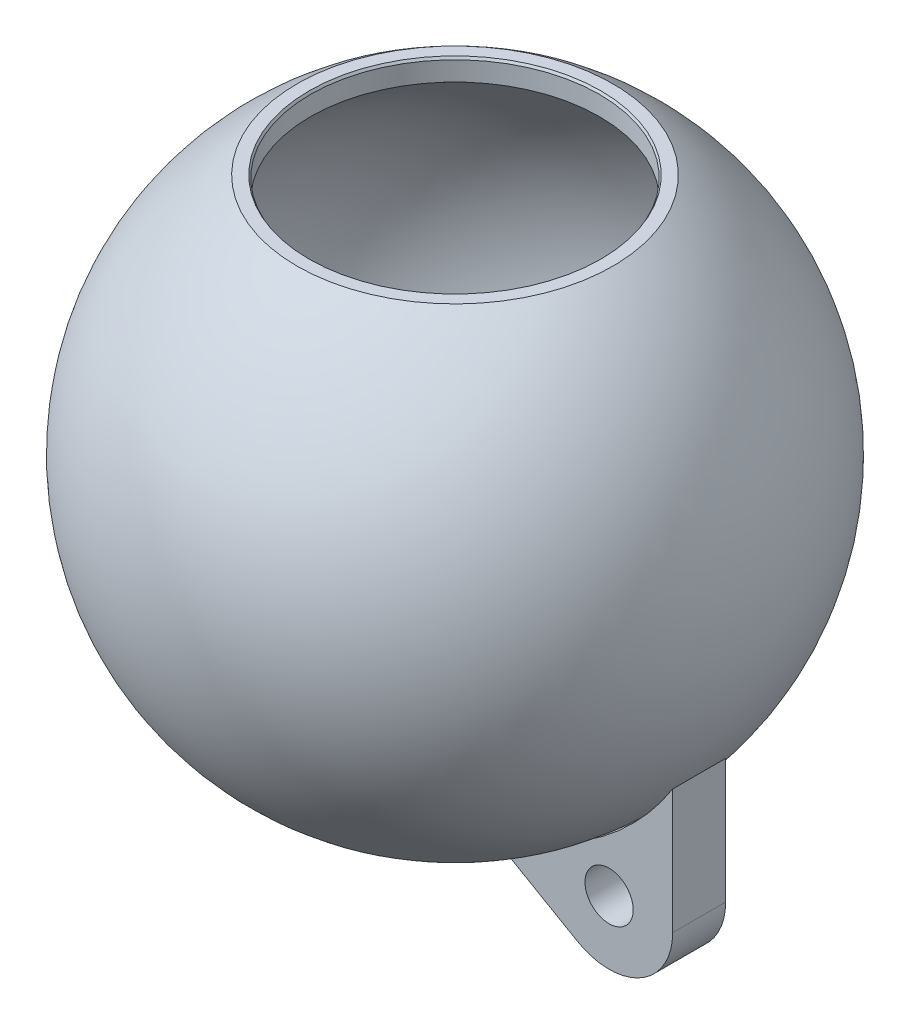
ISO-10303-21;
HEADER;
FILE_DESCRIPTION(('STEP AP214'),'2;1');
FILE_NAME('part.step','',(''),(''),'','','');
FILE_SCHEMA(('AUTOMOTIVE_DESIGN { 1 0 10303 214 1 1 1 1 }'));
ENDSEC;
DATA;
#1=APPLICATION_CONTEXT('core data for automotive mechanical design processes');
#2=APPLICATION_PROTOCOL_DEFINITION('international standard','automotive_design',2000,#1);
#3=PRODUCT_CONTEXT('',#1,'mechanical');
#4=PRODUCT('Part','Part','',(#3));
#5=PRODUCT_RELATED_PRODUCT_CATEGORY('part','',(#4));
#6=PRODUCT_DEFINITION_FORMATION('','',#4);
#7=PRODUCT_DEFINITION_CONTEXT('part definition',#1,'design');
#8=PRODUCT_DEFINITION('design','',#6,#7);
#9=PRODUCT_DEFINITION_SHAPE('','',#8);
#10=(LENGTH_UNIT() NAMED_UNIT(*) SI_UNIT(.MILLI.,.METRE.));
#11=(NAMED_UNIT(*) PLANE_ANGLE_UNIT() SI_UNIT($,.RADIAN.));
#12=(NAMED_UNIT(*) SI_UNIT($,.STERADIAN.) SOLID_ANGLE_UNIT());
#13=UNCERTAINTY_MEASURE_WITH_UNIT(LENGTH_MEASURE(1.E-05),#10,'distance_accuracy_value','');
#14=(GEOMETRIC_REPRESENTATION_CONTEXT(3) GLOBAL_UNCERTAINTY_ASSIGNED_CONTEXT((#13)) GLOBAL_UNIT_ASSIGNED_CONTEXT((#10,
#11,#12)) REPRESENTATION_CONTEXT('',''));
#15=CARTESIAN_POINT('',(0.,0.,0.));
#16=DIRECTION('',(0.,0.,1.));
#17=DIRECTION('',(1.,0.,0.));
#18=AXIS2_PLACEMENT_3D('',#15,#16,#17);
#19=CARTESIAN_POINT('',(95.2500000000001,-147.117317471466,-13.97));
#20=DIRECTION('',(0.,0.,1.));
#21=DIRECTION('',(1.,0.,0.));
#22=AXIS2_PLACEMENT_3D('',#19,#20,#21);
#23=CYLINDRICAL_SURFACE('',#22,33.528);
#24=DIRECTION('',(0.,0.,1.));
#25=VECTOR('',#24,1.);
#26=CARTESIAN_POINT('',(128.778,-147.117317471466,-13.97));
#27=LINE('',#26,#25);
#28=CARTESIAN_POINT('',(128.778,-147.117317471466,-13.97));
#29=VERTEX_POINT('',#28);
#30=CARTESIAN_POINT('',(128.778,-147.117317471466,13.97));
#31=VERTEX_POINT('',#30);
#32=EDGE_CURVE('E62',#29,#31,#27,.T.);
#33=ORIENTED_EDGE('',*,*,#32,.T.);
#34=CARTESIAN_POINT('',(95.2500000000001,-147.117317471466,13.97));
#35=DIRECTION('',(0.,0.,1.));
#36=DIRECTION('',(-1.,0.,0.));
#37=AXIS2_PLACEMENT_3D('',#34,#35,#36);
#38=CIRCLE('',#37,33.528);
#39=CARTESIAN_POINT('',(78.4859999999999,-176.15341720955,13.97));
#40=VERTEX_POINT('',#39);
#41=EDGE_CURVE('E103',#40,#31,#38,.T.);
#42=ORIENTED_EDGE('',*,*,#41,.F.);
#43=DIRECTION('',(0.,0.,1.));
#44=VECTOR('',#43,1.);
#45=CARTESIAN_POINT('',(78.4859999999999,-176.15341720955,-13.97));
#46=LINE('',#45,#44);
#47=CARTESIAN_POINT('',(78.4859999999999,-176.15341720955,-13.97));
#48=VERTEX_POINT('',#47);
#49=EDGE_CURVE('E13',#48,#40,#46,.T.);
#50=ORIENTED_EDGE('',*,*,#49,.F.);
#51=CARTESIAN_POINT('',(95.2500000000001,-147.117317471466,-13.97));
#52=DIRECTION('',(0.,0.,1.));
#53=DIRECTION('',(-1.,0.,0.));
#54=AXIS2_PLACEMENT_3D('',#51,#52,#53);
#55=CIRCLE('',#54,33.528);
#56=EDGE_CURVE('E104',#48,#29,#55,.T.);
#57=ORIENTED_EDGE('',*,*,#56,.T.);
#58=EDGE_LOOP('',(#33,#42,#50,#57));
#59=FACE_BOUND('',#58,.T.);
#60=ADVANCED_FACE('F59',(#59),#23,.T.);
#61=CARTESIAN_POINT('',(78.4859999999999,-176.15341720955,-13.97));
#62=DIRECTION('',(-0.500000000000004,-0.866025403784436,0.));
#63=DIRECTION('',(0.866025403784436,-0.500000000000004,0.));
#64=AXIS2_PLACEMENT_3D('',#61,#62,#63);
#65=PLANE('',#64);
#66=ORIENTED_EDGE('',*,*,#49,.T.);
#67=DIRECTION('',(0.866025403784436,-0.500000000000004,0.));
#68=VECTOR('',#67,1.);
#69=CARTESIAN_POINT('',(78.4859999999999,-176.15341720955,13.97));
#70=LINE('',#69,#68);
#71=CARTESIAN_POINT('',(31.6052209873836,-149.086786826796,13.97));
#72=VERTEX_POINT('',#71);
#73=EDGE_CURVE('E123',#72,#40,#70,.T.);
#74=ORIENTED_EDGE('',*,*,#73,.F.);
#75=DIRECTION('',(0.,0.,1.));
#76=VECTOR('',#75,1.);
#77=CARTESIAN_POINT('',(31.6052209873836,-149.086786826796,-13.97));
#78=LINE('',#77,#76);
#79=CARTESIAN_POINT('',(31.6052209873836,-149.086786826796,-13.97));
#80=VERTEX_POINT('',#79);
#81=EDGE_CURVE('E67',#80,#72,#78,.T.);
#82=ORIENTED_EDGE('',*,*,#81,.F.);
#83=DIRECTION('',(0.866025403784436,-0.500000000000004,0.));
#84=VECTOR('',#83,1.);
#85=CARTESIAN_POINT('',(78.4859999999999,-176.15341720955,-13.97));
#86=LINE('',#85,#84);
#87=EDGE_CURVE('E110',#80,#48,#86,.T.);
#88=ORIENTED_EDGE('',*,*,#87,.T.);
#89=EDGE_LOOP('',(#66,#74,#82,#88));
#90=FACE_BOUND('',#89,.T.);
#91=ADVANCED_FACE('F152',(#90),#65,.T.);
#92=CARTESIAN_POINT('',(0.,0.,-13.97));
#93=DIRECTION('',(0.,0.,1.));
#94=DIRECTION('',(1.,0.,0.));
#95=AXIS2_PLACEMENT_3D('',#92,#93,#94);
#96=CYLINDRICAL_SURFACE('',#95,152.4);
#97=ORIENTED_EDGE('',*,*,#81,.T.);
#98=CARTESIAN_POINT('',(0.,0.,13.97));
#99=DIRECTION('',(0.,0.,-1.));
#100=DIRECTION('',(1.,0.,0.));
#101=AXIS2_PLACEMENT_3D('',#98,#99,#100);
#102=CIRCLE('',#101,152.4);
#103=CARTESIAN_POINT('',(128.778,-81.4983847447298,13.97));
#104=VERTEX_POINT('',#103);
#105=EDGE_CURVE('E118',#104,#72,#102,.T.);
#106=ORIENTED_EDGE('',*,*,#105,.F.);
#107=DIRECTION('',(0.,0.,1.));
#108=VECTOR('',#107,1.);
#109=CARTESIAN_POINT('',(128.778,-81.4983847447298,-13.97));
#110=LINE('',#109,#108);
#111=CARTESIAN_POINT('',(128.778,-81.4983847447298,-13.97));
#112=VERTEX_POINT('',#111);
#113=EDGE_CURVE('E109',#112,#104,#110,.T.);
#114=ORIENTED_EDGE('',*,*,#113,.F.);
#115=CARTESIAN_POINT('',(0.,0.,-13.97));
#116=DIRECTION('',(0.,0.,-1.));
#117=DIRECTION('',(1.,0.,0.));
#118=AXIS2_PLACEMENT_3D('',#115,#116,#117);
#119=CIRCLE('',#118,152.4);
#120=EDGE_CURVE('E143',#112,#80,#119,.T.);
#121=ORIENTED_EDGE('',*,*,#120,.T.);
#122=EDGE_LOOP('',(#97,#106,#114,#121));
#123=FACE_BOUND('',#122,.T.);
#124=ADVANCED_FACE('F149',(#123),#96,.F.);
#125=CARTESIAN_POINT('',(128.778,-81.4983847447298,-13.97));
#126=DIRECTION('',(1.,0.,0.));
#127=DIRECTION('',(0.,0.,-1.));
#128=AXIS2_PLACEMENT_3D('',#125,#126,#127);
#129=PLANE('',#128);
#130=ORIENTED_EDGE('',*,*,#113,.T.);
#131=DIRECTION('',(0.,1.,0.));
#132=VECTOR('',#131,1.);
#133=CARTESIAN_POINT('',(128.778,-81.4983847447298,13.97));
#134=LINE('',#133,#132);
#135=EDGE_CURVE('E112',#31,#104,#134,.T.);
#136=ORIENTED_EDGE('',*,*,#135,.F.);
#137=ORIENTED_EDGE('',*,*,#32,.F.);
#138=DIRECTION('',(0.,1.,0.));
#139=VECTOR('',#138,1.);
#140=CARTESIAN_POINT('',(128.778,-81.4983847447298,-13.97));
#141=LINE('',#140,#139);
#142=EDGE_CURVE('E140',#29,#112,#141,.T.);
#143=ORIENTED_EDGE('',*,*,#142,.T.);
#144=EDGE_LOOP('',(#130,#136,#137,#143));
#145=FACE_BOUND('',#144,.T.);
#146=ADVANCED_FACE('F113',(#145),#129,.T.);
#147=CARTESIAN_POINT('',(95.2500000000001,-147.117317471466,-13.97));
#148=DIRECTION('',(0.,0.,-1.));
#149=DIRECTION('',(-1.,0.,0.));
#150=AXIS2_PLACEMENT_3D('',#147,#148,#149);
#151=PLANE('',#150);
#152=CARTESIAN_POINT('',(95.2500000000001,-147.117317471466,-13.97));
#153=DIRECTION('',(0.,0.,1.));
#154=DIRECTION('',(-1.,0.,0.));
#155=AXIS2_PLACEMENT_3D('',#152,#153,#154);
#156=CIRCLE('',#155,12.7);
#157=CARTESIAN_POINT('',(82.5500000000001,-147.117317471466,-13.97));
#158=VERTEX_POINT('',#157);
#159=EDGE_CURVE('E135',#158,#158,#156,.T.);
#160=ORIENTED_EDGE('',*,*,#159,.T.);
#161=EDGE_LOOP('',(#160));
#162=FACE_BOUND('',#161,.T.);
#163=ORIENTED_EDGE('',*,*,#56,.F.);
#164=ORIENTED_EDGE('',*,*,#87,.F.);
#165=ORIENTED_EDGE('',*,*,#120,.F.);
#166=ORIENTED_EDGE('',*,*,#142,.F.);
#167=EDGE_LOOP('',(#163,#164,#165,#166));
#168=FACE_BOUND('',#167,.T.);
#169=ADVANCED_FACE('F154',(#162,#168),#151,.T.);
#170=CARTESIAN_POINT('',(95.2500000000001,-147.117317471466,-13.97));
#171=DIRECTION('',(0.,0.,1.));
#172=DIRECTION('',(1.,0.,0.));
#173=AXIS2_PLACEMENT_3D('',#170,#171,#172);
#174=CYLINDRICAL_SURFACE('',#173,12.7);
#175=ORIENTED_EDGE('',*,*,#159,.F.);
#176=EDGE_LOOP('',(#175));
#177=FACE_BOUND('',#176,.T.);
#178=CARTESIAN_POINT('',(95.2500000000001,-147.117317471466,13.97));
#179=DIRECTION('',(0.,0.,1.));
#180=DIRECTION('',(-1.,0.,0.));
#181=AXIS2_PLACEMENT_3D('',#178,#179,#180);
#182=CIRCLE('',#181,12.7);
#183=CARTESIAN_POINT('',(82.5500000000001,-147.117317471466,13.97));
#184=VERTEX_POINT('',#183);
#185=EDGE_CURVE('E125',#184,#184,#182,.T.);
#186=ORIENTED_EDGE('',*,*,#185,.T.);
#187=EDGE_LOOP('',(#186));
#188=FACE_BOUND('',#187,.T.);
#189=ADVANCED_FACE('F156',(#177,#188),#174,.F.);
#190=CARTESIAN_POINT('',(95.2500000000001,-147.117317471466,13.97));
#191=DIRECTION('',(0.,0.,-1.));
#192=DIRECTION('',(-1.,0.,0.));
#193=AXIS2_PLACEMENT_3D('',#190,#191,#192);
#194=PLANE('',#193);
#195=ORIENTED_EDGE('',*,*,#41,.T.);
#196=ORIENTED_EDGE('',*,*,#135,.T.);
#197=ORIENTED_EDGE('',*,*,#105,.T.);
#198=ORIENTED_EDGE('',*,*,#73,.T.);
#199=EDGE_LOOP('',(#195,#196,#197,#198));
#200=FACE_BOUND('',#199,.T.);
#201=ORIENTED_EDGE('',*,*,#185,.F.);
#202=EDGE_LOOP('',(#201));
#203=FACE_BOUND('',#202,.T.);
#204=ADVANCED_FACE('F121',(#200,#203),#194,.F.);
#205=CLOSED_SHELL('',(#60,#91,#124,#146,#169,#189,#204));
#206=MANIFOLD_SOLID_BREP('B2',#205);
#207=CARTESIAN_POINT('',(0.,0.,-13.97));
#208=DIRECTION('',(0.,0.,1.));
#209=DIRECTION('',(1.,0.,0.));
#210=AXIS2_PLACEMENT_3D('',#207,#208,#209);
#211=CYLINDRICAL_SURFACE('',#210,152.4);
#212=DIRECTION('',(0.,0.,1.));
#213=VECTOR('',#212,1.);
#214=CARTESIAN_POINT('',(-128.778,-81.4983847447298,-13.97));
#215=LINE('',#214,#213);
#216=CARTESIAN_POINT('',(-128.778,-81.4983847447298,-13.97));
#217=VERTEX_POINT('',#216);
#218=CARTESIAN_POINT('',(-128.778,-81.4983847447298,13.97));
#219=VERTEX_POINT('',#218);
#220=EDGE_CURVE('E229',#217,#219,#215,.T.);
#221=ORIENTED_EDGE('',*,*,#220,.T.);
#222=CARTESIAN_POINT('',(0.,0.,13.97));
#223=DIRECTION('',(0.,0.,-1.));
#224=DIRECTION('',(-1.,0.,0.));
#225=AXIS2_PLACEMENT_3D('',#222,#223,#224);
#226=CIRCLE('',#225,152.4);
#227=CARTESIAN_POINT('',(-31.6052209873835,-149.086786826797,13.97));
#228=VERTEX_POINT('',#227);
#229=EDGE_CURVE('E266',#228,#219,#226,.T.);
#230=ORIENTED_EDGE('',*,*,#229,.F.);
#231=DIRECTION('',(0.,0.,1.));
#232=VECTOR('',#231,1.);
#233=CARTESIAN_POINT('',(-31.6052209873835,-149.086786826797,-13.97));
#234=LINE('',#233,#232);
#235=CARTESIAN_POINT('',(-31.6052209873835,-149.086786826797,-13.97));
#236=VERTEX_POINT('',#235);
#237=EDGE_CURVE('E57',#236,#228,#234,.T.);
#238=ORIENTED_EDGE('',*,*,#237,.F.);
#239=CARTESIAN_POINT('',(0.,0.,-13.97));
#240=DIRECTION('',(0.,0.,-1.));
#241=DIRECTION('',(-1.,0.,0.));
#242=AXIS2_PLACEMENT_3D('',#239,#240,#241);
#243=CIRCLE('',#242,152.4);
#244=EDGE_CURVE('E267',#236,#217,#243,.T.);
#245=ORIENTED_EDGE('',*,*,#244,.T.);
#246=EDGE_LOOP('',(#221,#230,#238,#245));
#247=FACE_BOUND('',#246,.T.);
#248=ADVANCED_FACE('F226',(#247),#211,.F.);
#249=CARTESIAN_POINT('',(-78.4859999999998,-176.15341720955,-13.97));
#250=DIRECTION('',(0.500000000000004,-0.866025403784436,0.));
#251=DIRECTION('',(0.866025403784437,0.500000000000004,0.));
#252=AXIS2_PLACEMENT_3D('',#249,#250,#251);
#253=PLANE('',#252);
#254=ORIENTED_EDGE('',*,*,#237,.T.);
#255=DIRECTION('',(0.866025403784437,0.500000000000004,0.));
#256=VECTOR('',#255,1.);
#257=CARTESIAN_POINT('',(-78.4859999999998,-176.15341720955,13.97));
#258=LINE('',#257,#256);
#259=CARTESIAN_POINT('',(-78.4859999999998,-176.15341720955,13.97));
#260=VERTEX_POINT('',#259);
#261=EDGE_CURVE('E284',#260,#228,#258,.T.);
#262=ORIENTED_EDGE('',*,*,#261,.F.);
#263=DIRECTION('',(0.,0.,1.));
#264=VECTOR('',#263,1.);
#265=CARTESIAN_POINT('',(-78.4859999999998,-176.15341720955,-13.97));
#266=LINE('',#265,#264);
#267=CARTESIAN_POINT('',(-78.4859999999998,-176.15341720955,-13.97));
#268=VERTEX_POINT('',#267);
#269=EDGE_CURVE('E234',#268,#260,#266,.T.);
#270=ORIENTED_EDGE('',*,*,#269,.F.);
#271=DIRECTION('',(0.866025403784437,0.500000000000004,0.));
#272=VECTOR('',#271,1.);
#273=CARTESIAN_POINT('',(-78.4859999999998,-176.15341720955,-13.97));
#274=LINE('',#273,#272);
#275=EDGE_CURVE('E272',#268,#236,#274,.T.);
#276=ORIENTED_EDGE('',*,*,#275,.T.);
#277=EDGE_LOOP('',(#254,#262,#270,#276));
#278=FACE_BOUND('',#277,.T.);
#279=ADVANCED_FACE('F307',(#278),#253,.T.);
#280=CARTESIAN_POINT('',(-95.25,-147.117317471466,-13.97));
#281=DIRECTION('',(0.,0.,1.));
#282=DIRECTION('',(1.,0.,0.));
#283=AXIS2_PLACEMENT_3D('',#280,#281,#282);
#284=CYLINDRICAL_SURFACE('',#283,33.528);
#285=ORIENTED_EDGE('',*,*,#269,.T.);
#286=CARTESIAN_POINT('',(-95.25,-147.117317471466,13.97));
#287=DIRECTION('',(0.,0.,1.));
#288=DIRECTION('',(1.,0.,0.));
#289=AXIS2_PLACEMENT_3D('',#286,#287,#288);
#290=CIRCLE('',#289,33.528);
#291=CARTESIAN_POINT('',(-128.778,-147.117317471466,13.97));
#292=VERTEX_POINT('',#291);
#293=EDGE_CURVE('E279',#292,#260,#290,.T.);
#294=ORIENTED_EDGE('',*,*,#293,.F.);
#295=DIRECTION('',(0.,0.,1.));
#296=VECTOR('',#295,1.);
#297=CARTESIAN_POINT('',(-128.778,-147.117317471466,-13.97));
#298=LINE('',#297,#296);
#299=CARTESIAN_POINT('',(-128.778,-147.117317471466,-13.97));
#300=VERTEX_POINT('',#299);
#301=EDGE_CURVE('E271',#300,#292,#298,.T.);
#302=ORIENTED_EDGE('',*,*,#301,.F.);
#303=CARTESIAN_POINT('',(-95.25,-147.117317471466,-13.97));
#304=DIRECTION('',(0.,0.,1.));
#305=DIRECTION('',(1.,0.,0.));
#306=AXIS2_PLACEMENT_3D('',#303,#304,#305);
#307=CIRCLE('',#306,33.528);
#308=EDGE_CURVE('E300',#300,#268,#307,.T.);
#309=ORIENTED_EDGE('',*,*,#308,.T.);
#310=EDGE_LOOP('',(#285,#294,#302,#309));
#311=FACE_BOUND('',#310,.T.);
#312=ADVANCED_FACE('F304',(#311),#284,.T.);
#313=CARTESIAN_POINT('',(-128.778,-81.4983847447298,-13.97));
#314=DIRECTION('',(-1.,0.,0.));
#315=DIRECTION('',(0.,0.,1.));
#316=AXIS2_PLACEMENT_3D('',#313,#314,#315);
#317=PLANE('',#316);
#318=ORIENTED_EDGE('',*,*,#301,.T.);
#319=DIRECTION('',(0.,-1.,0.));
#320=VECTOR('',#319,1.);
#321=CARTESIAN_POINT('',(-128.778,-81.4983847447298,13.97));
#322=LINE('',#321,#320);
#323=EDGE_CURVE('E274',#219,#292,#322,.T.);
#324=ORIENTED_EDGE('',*,*,#323,.F.);
#325=ORIENTED_EDGE('',*,*,#220,.F.);
#326=DIRECTION('',(0.,-1.,0.));
#327=VECTOR('',#326,1.);
#328=CARTESIAN_POINT('',(-128.778,-81.4983847447298,-13.97));
#329=LINE('',#328,#327);
#330=EDGE_CURVE('E298',#217,#300,#329,.T.);
#331=ORIENTED_EDGE('',*,*,#330,.T.);
#332=EDGE_LOOP('',(#318,#324,#325,#331));
#333=FACE_BOUND('',#332,.T.);
#334=ADVANCED_FACE('F275',(#333),#317,.T.);
#335=CARTESIAN_POINT('',(0.,0.,-13.97));
#336=DIRECTION('',(0.,0.,-1.));
#337=DIRECTION('',(-1.,0.,0.));
#338=AXIS2_PLACEMENT_3D('',#335,#336,#337);
#339=PLANE('',#338);
#340=CARTESIAN_POINT('',(-95.25,-147.117317471466,-13.97));
#341=DIRECTION('',(0.,0.,1.));
#342=DIRECTION('',(1.,0.,0.));
#343=AXIS2_PLACEMENT_3D('',#340,#341,#342);
#344=CIRCLE('',#343,12.7);
#345=CARTESIAN_POINT('',(-82.55,-147.117317471466,-13.97));
#346=VERTEX_POINT('',#345);
#347=EDGE_CURVE('E294',#346,#346,#344,.T.);
#348=ORIENTED_EDGE('',*,*,#347,.T.);
#349=EDGE_LOOP('',(#348));
#350=FACE_BOUND('',#349,.T.);
#351=ORIENTED_EDGE('',*,*,#244,.F.);
#352=ORIENTED_EDGE('',*,*,#275,.F.);
#353=ORIENTED_EDGE('',*,*,#308,.F.);
#354=ORIENTED_EDGE('',*,*,#330,.F.);
#355=EDGE_LOOP('',(#351,#352,#353,#354));
#356=FACE_BOUND('',#355,.T.);
#357=ADVANCED_FACE('F309',(#350,#356),#339,.T.);
#358=CARTESIAN_POINT('',(-95.25,-147.117317471466,-13.97));
#359=DIRECTION('',(0.,0.,1.));
#360=DIRECTION('',(1.,0.,0.));
#361=AXIS2_PLACEMENT_3D('',#358,#359,#360);
#362=CYLINDRICAL_SURFACE('',#361,12.7);
#363=ORIENTED_EDGE('',*,*,#347,.F.);
#364=EDGE_LOOP('',(#363));
#365=FACE_BOUND('',#364,.T.);
#366=CARTESIAN_POINT('',(-95.25,-147.117317471466,13.97));
#367=DIRECTION('',(0.,0.,1.));
#368=DIRECTION('',(1.,0.,0.));
#369=AXIS2_PLACEMENT_3D('',#366,#367,#368);
#370=CIRCLE('',#369,12.7);
#371=CARTESIAN_POINT('',(-82.55,-147.117317471466,13.97));
#372=VERTEX_POINT('',#371);
#373=EDGE_CURVE('E286',#372,#372,#370,.T.);
#374=ORIENTED_EDGE('',*,*,#373,.T.);
#375=EDGE_LOOP('',(#374));
#376=FACE_BOUND('',#375,.T.);
#377=ADVANCED_FACE('F311',(#365,#376),#362,.F.);
#378=CARTESIAN_POINT('',(0.,0.,13.97));
#379=DIRECTION('',(0.,0.,-1.));
#380=DIRECTION('',(-1.,0.,0.));
#381=AXIS2_PLACEMENT_3D('',#378,#379,#380);
#382=PLANE('',#381);
#383=ORIENTED_EDGE('',*,*,#229,.T.);
#384=ORIENTED_EDGE('',*,*,#323,.T.);
#385=ORIENTED_EDGE('',*,*,#293,.T.);
#386=ORIENTED_EDGE('',*,*,#261,.T.);
#387=EDGE_LOOP('',(#383,#384,#385,#386));
#388=FACE_BOUND('',#387,.T.);
#389=ORIENTED_EDGE('',*,*,#373,.F.);
#390=EDGE_LOOP('',(#389));
#391=FACE_BOUND('',#390,.T.);
#392=ADVANCED_FACE('F282',(#388,#391),#382,.F.);
#393=CLOSED_SHELL('',(#248,#279,#312,#334,#357,#377,#392));
#394=MANIFOLD_SOLID_BREP('B7',#393);
#395=CARTESIAN_POINT('',(0.,152.4,0.));
#396=DIRECTION('',(0.,-1.,0.));
#397=DIRECTION('',(0.,0.,-1.));
#398=AXIS2_PLACEMENT_3D('',#395,#396,#397);
#399=CYLINDRICAL_SURFACE('',#398,76.2);
#400=CARTESIAN_POINT('',(0.,126.338000688599,0.));
#401=DIRECTION('',(0.,1.,0.));
#402=DIRECTION('',(0.,0.,1.));
#403=AXIS2_PLACEMENT_3D('',#400,#401,#402);
#404=CIRCLE('',#403,76.2);
#405=CARTESIAN_POINT('',(0.,126.338000688599,-76.2));
#406=VERTEX_POINT('',#405);
#407=EDGE_CURVE('E382',#406,#406,#404,.T.);
#408=CARTESIAN_POINT('',(0.,116.178000688599,0.));
#409=DIRECTION('',(0.,-1.,0.));
#410=DIRECTION('',(0.,0.,-1.));
#411=AXIS2_PLACEMENT_3D('',#408,#409,#410);
#412=CIRCLE('',#411,76.2);
#413=CARTESIAN_POINT('',(0.,116.178000688599,-76.2));
#414=VERTEX_POINT('',#413);
#415=EDGE_CURVE('E388',#414,#414,#412,.F.);
#416=CARTESIAN_POINT('',(0.,126.338000688599,-76.2));
#417=CARTESIAN_POINT('',(0.,126.232167355266,-76.2));
#418=CARTESIAN_POINT('',(0.,126.126334021932,-76.2));
#419=CARTESIAN_POINT('',(0.,125.914667355266,-76.2));
#420=CARTESIAN_POINT('',(0.,125.808834021932,-76.2));
#421=CARTESIAN_POINT('',(0.,125.597167355266,-76.2));
#422=CARTESIAN_POINT('',(0.,125.491334021932,-76.2));
#423=CARTESIAN_POINT('',(0.,125.279667355266,-76.2));
#424=CARTESIAN_POINT('',(0.,125.173834021932,-76.2));
#425=CARTESIAN_POINT('',(0.,124.962167355266,-76.2));
#426=CARTESIAN_POINT('',(0.,124.856334021932,-76.2));
#427=CARTESIAN_POINT('',(0.,124.644667355266,-76.2));
#428=CARTESIAN_POINT('',(0.,124.538834021932,-76.2));
#429=CARTESIAN_POINT('',(0.,124.327167355266,-76.2));
#430=CARTESIAN_POINT('',(0.,124.221334021932,-76.2));
#431=CARTESIAN_POINT('',(0.,124.009667355266,-76.2));
#432=CARTESIAN_POINT('',(0.,123.903834021932,-76.2));
#433=CARTESIAN_POINT('',(0.,123.692167355266,-76.2));
#434=CARTESIAN_POINT('',(0.,123.586334021932,-76.2));
#435=CARTESIAN_POINT('',(0.,123.374667355266,-76.2));
#436=CARTESIAN_POINT('',(0.,123.268834021932,-76.2));
#437=CARTESIAN_POINT('',(0.,123.057167355266,-76.2));
#438=CARTESIAN_POINT('',(0.,122.951334021932,-76.2));
#439=CARTESIAN_POINT('',(0.,122.739667355266,-76.2));
#440=CARTESIAN_POINT('',(0.,122.633834021932,-76.2));
#441=CARTESIAN_POINT('',(0.,122.422167355266,-76.2));
#442=CARTESIAN_POINT('',(0.,122.316334021932,-76.2));
#443=CARTESIAN_POINT('',(0.,122.104667355265,-76.2));
#444=CARTESIAN_POINT('',(0.,121.998834021932,-76.2));
#445=CARTESIAN_POINT('',(0.,121.787167355265,-76.2));
#446=CARTESIAN_POINT('',(0.,121.681334021932,-76.2));
#447=CARTESIAN_POINT('',(0.,121.469667355265,-76.2));
#448=CARTESIAN_POINT('',(0.,121.363834021932,-76.2));
#449=CARTESIAN_POINT('',(0.,121.152167355265,-76.2));
#450=CARTESIAN_POINT('',(0.,121.046334021932,-76.2));
#451=CARTESIAN_POINT('',(0.,120.834667355265,-76.2));
#452=CARTESIAN_POINT('',(0.,120.728834021932,-76.2));
#453=CARTESIAN_POINT('',(0.,120.517167355265,-76.2));
#454=CARTESIAN_POINT('',(0.,120.411334021932,-76.2));
#455=CARTESIAN_POINT('',(0.,120.199667355265,-76.2));
#456=CARTESIAN_POINT('',(0.,120.093834021932,-76.2));
#457=CARTESIAN_POINT('',(0.,119.882167355265,-76.2));
#458=CARTESIAN_POINT('',(0.,119.776334021932,-76.2));
#459=CARTESIAN_POINT('',(0.,119.564667355265,-76.2));
#460=CARTESIAN_POINT('',(0.,119.458834021932,-76.2));
#461=CARTESIAN_POINT('',(0.,119.247167355265,-76.2));
#462=CARTESIAN_POINT('',(0.,119.141334021932,-76.2));
#463=CARTESIAN_POINT('',(0.,118.929667355265,-76.2));
#464=CARTESIAN_POINT('',(0.,118.823834021932,-76.2));
#465=CARTESIAN_POINT('',(0.,118.612167355265,-76.2));
#466=CARTESIAN_POINT('',(0.,118.506334021932,-76.2));
#467=CARTESIAN_POINT('',(0.,118.294667355265,-76.2));
#468=CARTESIAN_POINT('',(0.,118.188834021932,-76.2));
#469=CARTESIAN_POINT('',(0.,117.977167355265,-76.2));
#470=CARTESIAN_POINT('',(0.,117.871334021932,-76.2));
#471=CARTESIAN_POINT('',(0.,117.659667355265,-76.2));
#472=CARTESIAN_POINT('',(0.,117.553834021932,-76.2));
#473=CARTESIAN_POINT('',(0.,117.342167355265,-76.2));
#474=CARTESIAN_POINT('',(0.,117.236334021932,-76.2));
#475=CARTESIAN_POINT('',(0.,117.024667355265,-76.2));
#476=CARTESIAN_POINT('',(0.,116.918834021932,-76.2));
#477=CARTESIAN_POINT('',(0.,116.707167355265,-76.2));
#478=CARTESIAN_POINT('',(0.,116.601334021932,-76.2));
#479=CARTESIAN_POINT('',(0.,116.389667355265,-76.2));
#480=CARTESIAN_POINT('',(0.,116.283834021932,-76.2));
#481=CARTESIAN_POINT('',(0.,116.178000688599,-76.2));
#482=B_SPLINE_CURVE_WITH_KNOTS('',3,(#416,#417,#418,#419,#420,#421,#422,#423,#424,#425,#426,
#427,#428,#429,#430,#431,#432,#433,#434,#435,#436,#437,#438,#439,#440,#441,#442,#443,#444,#445,
#446,#447,#448,#449,#450,#451,#452,#453,#454,#455,#456,#457,#458,#459,#460,#461,#462,#463,#464,
#465,#466,#467,#468,#469,#470,#471,#472,#473,#474,#475,#476,#477,#478,#479,#480,#481),
.UNSPECIFIED.,.F.,.F.,(4,2,2,2,2,2,2,2,2,2,2,2,2,2,2,2,2,2,2,2,2,2,2,2,2,2,2,2,2,2,2,2,4),(0.,
0.317500000000026,0.635000000000024,0.952500000000051,1.27000000000005,1.58750000000007,
1.90500000000009,2.2225000000001,2.54000000000011,2.85750000000012,3.17500000000014,
3.49250000000015,3.81000000000016,4.12750000000017,4.44500000000019,4.7625000000002,
5.08000000000021,5.39750000000022,5.71500000000023,6.03250000000025,6.35000000000026,
6.66750000000027,6.98500000000028,7.3025000000003,7.62000000000032,7.93750000000032,
8.25500000000035,8.57250000000034,8.89000000000037,9.20750000000037,9.52500000000039,
9.84250000000039,10.1600000000004),.UNSPECIFIED.);
#483=EDGE_CURVE('BSEAM374',#406,#414,#482,.T.);
#484=ORIENTED_EDGE('',*,*,#407,.T.);
#485=ORIENTED_EDGE('',*,*,#415,.F.);
#486=ORIENTED_EDGE('',*,*,#483,.T.);
#487=ORIENTED_EDGE('',*,*,#483,.F.);
#488=EDGE_LOOP('',(#484,#486,#485,#487));
#489=FACE_BOUND('',#488,.T.);
#490=ADVANCED_FACE('F374',(#489),#399,.F.);
#491=CARTESIAN_POINT('',(0.,0.,0.));
#492=DIRECTION('',(0.,0.,1.));
#493=DIRECTION('',(-1.,0.,0.));
#494=AXIS2_PLACEMENT_3D('',#491,#492,#493);
#495=SPHERICAL_SURFACE('',#494,138.938);
#496=CARTESIAN_POINT('',(0.,0.,0.));
#497=DIRECTION('',(0.,-1.,0.));
#498=DIRECTION('',(0.,0.,-1.));
#499=AXIS2_PLACEMENT_3D('',#496,#497,#498);
#500=SPHERICAL_SURFACE('',#499,138.938);
#501=ORIENTED_EDGE('',*,*,#415,.T.);
#502=EDGE_LOOP('',(#501));
#503=FACE_BOUND('',#502,.T.);
#504=ADVANCED_FACE('F409',(#503),#500,.F.);
#505=CARTESIAN_POINT('',(0.,127.608000688599,0.));
#506=DIRECTION('',(0.,1.,0.));
#507=DIRECTION('',(0.,0.,1.));
#508=AXIS2_PLACEMENT_3D('',#505,#506,#507);
#509=PLANE('',#508);
#510=CARTESIAN_POINT('',(0.,127.608000688599,0.));
#511=DIRECTION('',(0.,1.,0.));
#512=DIRECTION('',(0.,0.,1.));
#513=AXIS2_PLACEMENT_3D('',#510,#511,#512);
#514=CIRCLE('',#513,76.9332348418706);
#515=CARTESIAN_POINT('',(0.,127.608000688599,76.9332348418706));
#516=VERTEX_POINT('',#515);
#517=EDGE_CURVE('E225',#516,#516,#514,.F.);
#518=ORIENTED_EDGE('',*,*,#517,.T.);
#519=EDGE_LOOP('',(#518));
#520=FACE_BOUND('',#519,.T.);
#521=CARTESIAN_POINT('',(0.,127.608000688599,0.));
#522=DIRECTION('',(0.,1.,0.));
#523=DIRECTION('',(0.,0.,1.));
#524=AXIS2_PLACEMENT_3D('',#521,#522,#523);
#525=CIRCLE('',#524,83.3184142927518);
#526=CARTESIAN_POINT('',(0.,127.608000688599,83.3184142927518));
#527=VERTEX_POINT('',#526);
#528=EDGE_CURVE('E393',#527,#527,#525,.T.);
#529=ORIENTED_EDGE('',*,*,#528,.T.);
#530=EDGE_LOOP('',(#529));
#531=FACE_BOUND('',#530,.T.);
#532=ADVANCED_FACE('F399',(#520,#531),#509,.T.);
#533=CARTESIAN_POINT('',(0.,0.,0.));
#534=DIRECTION('',(0.,0.,1.));
#535=DIRECTION('',(-1.,0.,0.));
#536=AXIS2_PLACEMENT_3D('',#533,#534,#535);
#537=SPHERICAL_SURFACE('',#536,152.4);
#538=CARTESIAN_POINT('',(0.,0.,0.));
#539=DIRECTION('',(0.,1.,0.));
#540=DIRECTION('',(0.,0.,1.));
#541=AXIS2_PLACEMENT_3D('',#538,#539,#540);
#542=SPHERICAL_SURFACE('',#541,152.4);
#543=ORIENTED_EDGE('',*,*,#528,.F.);
#544=EDGE_LOOP('',(#543));
#545=FACE_BOUND('',#544,.T.);
#546=ADVANCED_FACE('F401',(#545),#542,.T.);
#547=CARTESIAN_POINT('',(0.,126.338000688599,0.));
#548=DIRECTION('',(0.,1.,0.));
#549=DIRECTION('',(0.,0.,1.));
#550=AXIS2_PLACEMENT_3D('',#547,#548,#549);
#551=CONICAL_SURFACE('',#550,76.2,0.523598775598285);
#552=ORIENTED_EDGE('',*,*,#517,.F.);
#553=EDGE_LOOP('',(#552));
#554=FACE_BOUND('',#553,.T.);
#555=ORIENTED_EDGE('',*,*,#407,.F.);
#556=EDGE_LOOP('',(#555));
#557=FACE_BOUND('',#556,.T.);
#558=ADVANCED_FACE('F376',(#554,#557),#551,.F.);
#559=CLOSED_SHELL('',(#490,#504,#532,#546,#558));
#560=MANIFOLD_SOLID_BREP('B51',#559);
#561=ADVANCED_BREP_SHAPE_REPRESENTATION('',(#18,#206,#394,#560),#14);
#562=SHAPE_DEFINITION_REPRESENTATION(#9,#561);
ENDSEC;
END-ISO-10303-21;
